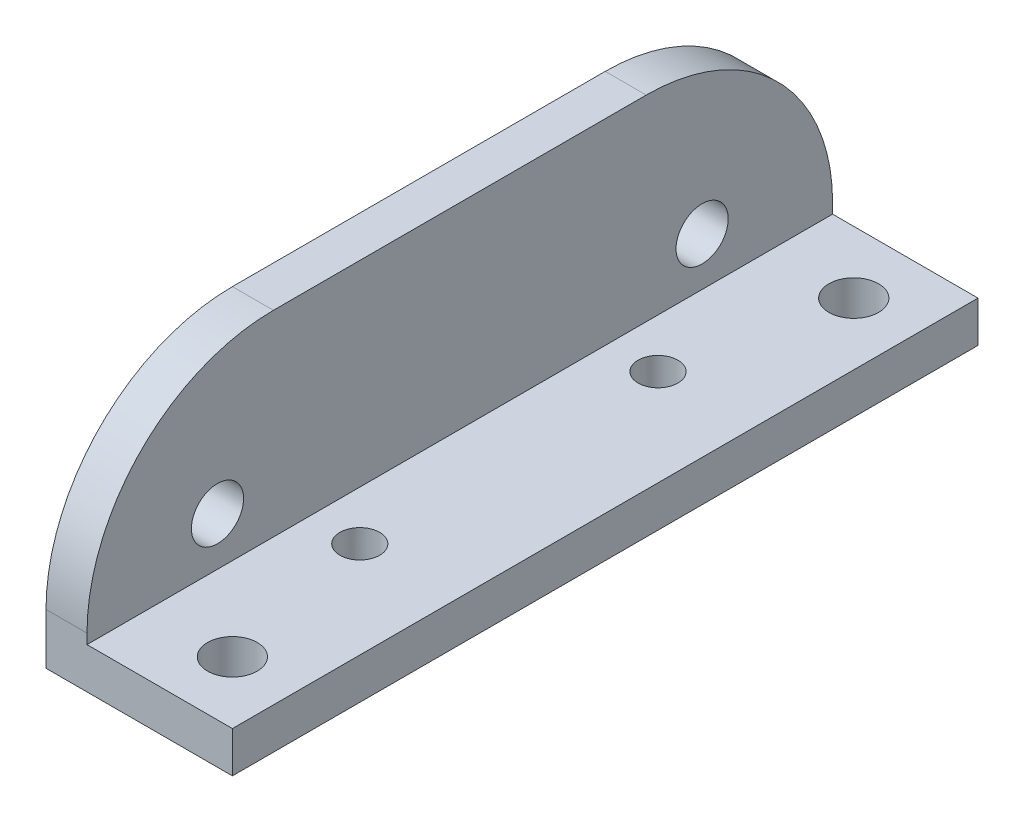
ISO-10303-21;
HEADER;
FILE_DESCRIPTION(('STEP AP214'),'2;1');
FILE_NAME('part.step','',(''),(''),'','','');
FILE_SCHEMA(('AUTOMOTIVE_DESIGN { 1 0 10303 214 1 1 1 1 }'));
ENDSEC;
DATA;
#1=APPLICATION_CONTEXT('core data for automotive mechanical design processes');
#2=APPLICATION_PROTOCOL_DEFINITION('international standard','automotive_design',2000,#1);
#3=PRODUCT_CONTEXT('',#1,'mechanical');
#4=PRODUCT('Part','Part','',(#3));
#5=PRODUCT_RELATED_PRODUCT_CATEGORY('part','',(#4));
#6=PRODUCT_DEFINITION_FORMATION('','',#4);
#7=PRODUCT_DEFINITION_CONTEXT('part definition',#1,'design');
#8=PRODUCT_DEFINITION('design','',#6,#7);
#9=PRODUCT_DEFINITION_SHAPE('','',#8);
#10=(LENGTH_UNIT() NAMED_UNIT(*) SI_UNIT(.MILLI.,.METRE.));
#11=(NAMED_UNIT(*) PLANE_ANGLE_UNIT() SI_UNIT($,.RADIAN.));
#12=(NAMED_UNIT(*) SI_UNIT($,.STERADIAN.) SOLID_ANGLE_UNIT());
#13=UNCERTAINTY_MEASURE_WITH_UNIT(LENGTH_MEASURE(1.E-05),#10,'distance_accuracy_value','');
#14=(GEOMETRIC_REPRESENTATION_CONTEXT(3) GLOBAL_UNCERTAINTY_ASSIGNED_CONTEXT((#13)) GLOBAL_UNIT_ASSIGNED_CONTEXT((#10,
#11,#12)) REPRESENTATION_CONTEXT('',''));
#15=CARTESIAN_POINT('',(0.,0.,0.));
#16=DIRECTION('',(0.,0.,1.));
#17=DIRECTION('',(1.,0.,0.));
#18=AXIS2_PLACEMENT_3D('',#15,#16,#17);
#19=CARTESIAN_POINT('',(3.3,19.1,30.));
#20=DIRECTION('',(-1.,0.,0.));
#21=DIRECTION('',(0.,-1.,0.));
#22=AXIS2_PLACEMENT_3D('',#19,#20,#21);
#23=PLANE('',#22);
#24=CARTESIAN_POINT('',(3.3,7.18,19.5));
#25=DIRECTION('',(-1.,0.,0.));
#26=DIRECTION('',(0.,-1.,0.));
#27=AXIS2_PLACEMENT_3D('',#24,#25,#26);
#28=CIRCLE('',#27,2.09999999999999);
#29=CARTESIAN_POINT('',(3.3,5.08000000000001,19.5));
#30=VERTEX_POINT('',#29);
#31=EDGE_CURVE('E246',#30,#30,#28,.T.);
#32=ORIENTED_EDGE('',*,*,#31,.T.);
#33=EDGE_LOOP('',(#32));
#34=FACE_BOUND('',#33,.T.);
#35=CARTESIAN_POINT('',(3.3,7.18,-19.5));
#36=DIRECTION('',(-1.,0.,0.));
#37=DIRECTION('',(0.,-1.,0.));
#38=AXIS2_PLACEMENT_3D('',#35,#36,#37);
#39=CIRCLE('',#38,2.09999999999999);
#40=CARTESIAN_POINT('',(3.3,5.08000000000001,-19.5));
#41=VERTEX_POINT('',#40);
#42=EDGE_CURVE('E238',#41,#41,#39,.T.);
#43=ORIENTED_EDGE('',*,*,#42,.T.);
#44=EDGE_LOOP('',(#43));
#45=FACE_BOUND('',#44,.T.);
#46=CARTESIAN_POINT('',(3.3,4.1,-15.));
#47=DIRECTION('',(-1.,0.,0.));
#48=DIRECTION('',(0.,-1.,0.));
#49=AXIS2_PLACEMENT_3D('',#46,#47,#48);
#50=CIRCLE('',#49,15.);
#51=CARTESIAN_POINT('',(3.3,19.1,-15.));
#52=VERTEX_POINT('',#51);
#53=CARTESIAN_POINT('',(3.3,4.1,-30.));
#54=VERTEX_POINT('',#53);
#55=EDGE_CURVE('E60',#52,#54,#50,.T.);
#56=ORIENTED_EDGE('',*,*,#55,.F.);
#57=DIRECTION('',(0.,0.,-1.));
#58=VECTOR('',#57,1.);
#59=CARTESIAN_POINT('',(3.3,19.1,30.));
#60=LINE('',#59,#58);
#61=CARTESIAN_POINT('',(3.3,19.1,15.));
#62=VERTEX_POINT('',#61);
#63=EDGE_CURVE('E150',#62,#52,#60,.T.);
#64=ORIENTED_EDGE('',*,*,#63,.F.);
#65=CARTESIAN_POINT('',(3.3,4.1,15.));
#66=DIRECTION('',(-1.,0.,0.));
#67=DIRECTION('',(0.,-1.,0.));
#68=AXIS2_PLACEMENT_3D('',#65,#66,#67);
#69=CIRCLE('',#68,15.);
#70=CARTESIAN_POINT('',(3.3,4.1,30.));
#71=VERTEX_POINT('',#70);
#72=EDGE_CURVE('E174',#62,#71,#69,.F.);
#73=ORIENTED_EDGE('',*,*,#72,.T.);
#74=DIRECTION('',(0.,1.,0.));
#75=VECTOR('',#74,1.);
#76=CARTESIAN_POINT('',(3.3,19.1,30.));
#77=LINE('',#76,#75);
#78=CARTESIAN_POINT('',(3.3,3.3,30.));
#79=VERTEX_POINT('',#78);
#80=EDGE_CURVE('E182',#79,#71,#77,.T.);
#81=ORIENTED_EDGE('',*,*,#80,.F.);
#82=DIRECTION('',(0.,0.,-1.));
#83=VECTOR('',#82,1.);
#84=CARTESIAN_POINT('',(3.3,3.3,30.));
#85=LINE('',#84,#83);
#86=CARTESIAN_POINT('',(3.3,3.3,-30.));
#87=VERTEX_POINT('',#86);
#88=EDGE_CURVE('E154',#79,#87,#85,.T.);
#89=ORIENTED_EDGE('',*,*,#88,.T.);
#90=DIRECTION('',(0.,1.,0.));
#91=VECTOR('',#90,1.);
#92=CARTESIAN_POINT('',(3.3,19.1,-30.));
#93=LINE('',#92,#91);
#94=EDGE_CURVE('E133',#87,#54,#93,.T.);
#95=ORIENTED_EDGE('',*,*,#94,.T.);
#96=EDGE_LOOP('',(#56,#64,#73,#81,#89,#95));
#97=FACE_BOUND('',#96,.T.);
#98=ADVANCED_FACE('F45',(#34,#45,#97),#23,.F.);
#99=CARTESIAN_POINT('',(0.,0.,30.));
#100=DIRECTION('',(1.,0.,0.));
#101=DIRECTION('',(0.,0.,-1.));
#102=AXIS2_PLACEMENT_3D('',#99,#100,#101);
#103=PLANE('',#102);
#104=CARTESIAN_POINT('',(0.,7.18,19.5));
#105=DIRECTION('',(-1.,0.,0.));
#106=DIRECTION('',(0.,0.,1.));
#107=AXIS2_PLACEMENT_3D('',#104,#105,#106);
#108=CIRCLE('',#107,2.09999999999999);
#109=CARTESIAN_POINT('',(0.,7.18,21.6));
#110=VERTEX_POINT('',#109);
#111=EDGE_CURVE('E242',#110,#110,#108,.T.);
#112=ORIENTED_EDGE('',*,*,#111,.F.);
#113=EDGE_LOOP('',(#112));
#114=FACE_BOUND('',#113,.T.);
#115=CARTESIAN_POINT('',(0.,7.18,-19.5));
#116=DIRECTION('',(-1.,0.,0.));
#117=DIRECTION('',(0.,0.,1.));
#118=AXIS2_PLACEMENT_3D('',#115,#116,#117);
#119=CIRCLE('',#118,2.09999999999999);
#120=CARTESIAN_POINT('',(0.,7.18,-17.4));
#121=VERTEX_POINT('',#120);
#122=EDGE_CURVE('E234',#121,#121,#119,.T.);
#123=ORIENTED_EDGE('',*,*,#122,.F.);
#124=EDGE_LOOP('',(#123));
#125=FACE_BOUND('',#124,.T.);
#126=CARTESIAN_POINT('',(0.,4.1,-15.));
#127=DIRECTION('',(-1.,0.,0.));
#128=DIRECTION('',(0.,0.,1.));
#129=AXIS2_PLACEMENT_3D('',#126,#127,#128);
#130=CIRCLE('',#129,15.);
#131=CARTESIAN_POINT('',(0.,19.1,-15.));
#132=VERTEX_POINT('',#131);
#133=CARTESIAN_POINT('',(0.,4.1,-30.));
#134=VERTEX_POINT('',#133);
#135=EDGE_CURVE('E109',#132,#134,#130,.T.);
#136=ORIENTED_EDGE('',*,*,#135,.T.);
#137=DIRECTION('',(0.,-1.,0.));
#138=VECTOR('',#137,1.);
#139=CARTESIAN_POINT('',(0.,0.,-30.));
#140=LINE('',#139,#138);
#141=CARTESIAN_POINT('',(0.,0.,-30.));
#142=VERTEX_POINT('',#141);
#143=EDGE_CURVE('E119',#134,#142,#140,.T.);
#144=ORIENTED_EDGE('',*,*,#143,.T.);
#145=DIRECTION('',(0.,0.,-1.));
#146=VECTOR('',#145,1.);
#147=CARTESIAN_POINT('',(0.,0.,30.));
#148=LINE('',#147,#146);
#149=CARTESIAN_POINT('',(0.,0.,30.));
#150=VERTEX_POINT('',#149);
#151=EDGE_CURVE('E144',#150,#142,#148,.T.);
#152=ORIENTED_EDGE('',*,*,#151,.F.);
#153=DIRECTION('',(0.,-1.,0.));
#154=VECTOR('',#153,1.);
#155=CARTESIAN_POINT('',(0.,0.,30.));
#156=LINE('',#155,#154);
#157=CARTESIAN_POINT('',(0.,4.1,30.));
#158=VERTEX_POINT('',#157);
#159=EDGE_CURVE('E147',#158,#150,#156,.T.);
#160=ORIENTED_EDGE('',*,*,#159,.F.);
#161=CARTESIAN_POINT('',(0.,4.1,15.));
#162=DIRECTION('',(1.,0.,0.));
#163=DIRECTION('',(0.,0.,-1.));
#164=AXIS2_PLACEMENT_3D('',#161,#162,#163);
#165=CIRCLE('',#164,15.);
#166=CARTESIAN_POINT('',(0.,19.1,15.));
#167=VERTEX_POINT('',#166);
#168=EDGE_CURVE('E68',#167,#158,#165,.T.);
#169=ORIENTED_EDGE('',*,*,#168,.F.);
#170=DIRECTION('',(0.,0.,-1.));
#171=VECTOR('',#170,1.);
#172=CARTESIAN_POINT('',(0.,19.1,30.));
#173=LINE('',#172,#171);
#174=EDGE_CURVE('E122',#167,#132,#173,.T.);
#175=ORIENTED_EDGE('',*,*,#174,.T.);
#176=EDGE_LOOP('',(#136,#144,#152,#160,#169,#175));
#177=FACE_BOUND('',#176,.T.);
#178=ADVANCED_FACE('F117',(#114,#125,#177),#103,.F.);
#179=CARTESIAN_POINT('',(0.,0.,30.));
#180=DIRECTION('',(0.,0.,-1.));
#181=DIRECTION('',(-1.,0.,0.));
#182=AXIS2_PLACEMENT_3D('',#179,#180,#181);
#183=PLANE('',#182);
#184=DIRECTION('',(-1.,0.,0.));
#185=VECTOR('',#184,1.);
#186=CARTESIAN_POINT('',(10.,4.1,30.));
#187=LINE('',#186,#185);
#188=EDGE_CURVE('E54',#158,#71,#187,.F.);
#189=ORIENTED_EDGE('',*,*,#188,.F.);
#190=ORIENTED_EDGE('',*,*,#159,.T.);
#191=DIRECTION('',(1.,0.,0.));
#192=VECTOR('',#191,1.);
#193=CARTESIAN_POINT('',(19.1,0.,30.));
#194=LINE('',#193,#192);
#195=CARTESIAN_POINT('',(15.,0.,30.));
#196=VERTEX_POINT('',#195);
#197=EDGE_CURVE('E132',#150,#196,#194,.T.);
#198=ORIENTED_EDGE('',*,*,#197,.T.);
#199=DIRECTION('',(0.,-1.,0.));
#200=VECTOR('',#199,1.);
#201=CARTESIAN_POINT('',(15.,19.1,30.));
#202=LINE('',#201,#200);
#203=CARTESIAN_POINT('',(15.,3.3,30.));
#204=VERTEX_POINT('',#203);
#205=EDGE_CURVE('E253',#204,#196,#202,.T.);
#206=ORIENTED_EDGE('',*,*,#205,.F.);
#207=DIRECTION('',(-1.,0.,0.));
#208=VECTOR('',#207,1.);
#209=CARTESIAN_POINT('',(3.3,3.3,30.));
#210=LINE('',#209,#208);
#211=EDGE_CURVE('E138',#204,#79,#210,.T.);
#212=ORIENTED_EDGE('',*,*,#211,.T.);
#213=ORIENTED_EDGE('',*,*,#80,.T.);
#214=EDGE_LOOP('',(#189,#190,#198,#206,#212,#213));
#215=FACE_BOUND('',#214,.T.);
#216=ADVANCED_FACE('F186',(#215),#183,.F.);
#217=CARTESIAN_POINT('',(19.1,0.,30.));
#218=DIRECTION('',(0.,1.,0.));
#219=DIRECTION('',(-1.,0.,0.));
#220=AXIS2_PLACEMENT_3D('',#217,#218,#219);
#221=PLANE('',#220);
#222=CARTESIAN_POINT('',(7.24999999999996,0.,11.9999999999999));
#223=DIRECTION('',(0.,-1.,0.));
#224=DIRECTION('',(1.,0.,0.));
#225=AXIS2_PLACEMENT_3D('',#222,#223,#224);
#226=CIRCLE('',#225,1.6);
#227=CARTESIAN_POINT('',(8.84999999999997,0.,11.9999999999999));
#228=VERTEX_POINT('',#227);
#229=EDGE_CURVE('E170',#228,#228,#226,.T.);
#230=ORIENTED_EDGE('',*,*,#229,.F.);
#231=EDGE_LOOP('',(#230));
#232=FACE_BOUND('',#231,.T.);
#233=CARTESIAN_POINT('',(7.24999999999992,0.,-12.0000000000001));
#234=DIRECTION('',(0.,-1.,0.));
#235=DIRECTION('',(1.,0.,0.));
#236=AXIS2_PLACEMENT_3D('',#233,#234,#235);
#237=CIRCLE('',#236,1.6);
#238=CARTESIAN_POINT('',(8.84999999999992,0.,-12.0000000000001));
#239=VERTEX_POINT('',#238);
#240=EDGE_CURVE('E166',#239,#239,#237,.T.);
#241=ORIENTED_EDGE('',*,*,#240,.F.);
#242=EDGE_LOOP('',(#241));
#243=FACE_BOUND('',#242,.T.);
#244=CARTESIAN_POINT('',(10.,0.,-25.));
#245=DIRECTION('',(0.,-1.,0.));
#246=DIRECTION('',(0.,0.,-1.));
#247=AXIS2_PLACEMENT_3D('',#244,#245,#246);
#248=CIRCLE('',#247,2.);
#249=CARTESIAN_POINT('',(10.,0.,-27.));
#250=VERTEX_POINT('',#249);
#251=EDGE_CURVE('E226',#250,#250,#248,.T.);
#252=ORIENTED_EDGE('',*,*,#251,.F.);
#253=EDGE_LOOP('',(#252));
#254=FACE_BOUND('',#253,.T.);
#255=DIRECTION('',(1.,0.,0.));
#256=VECTOR('',#255,1.);
#257=CARTESIAN_POINT('',(19.1,0.,-30.));
#258=LINE('',#257,#256);
#259=CARTESIAN_POINT('',(15.,0.,-30.));
#260=VERTEX_POINT('',#259);
#261=EDGE_CURVE('E130',#142,#260,#258,.T.);
#262=ORIENTED_EDGE('',*,*,#261,.T.);
#263=DIRECTION('',(0.,0.,-1.));
#264=VECTOR('',#263,1.);
#265=CARTESIAN_POINT('',(15.,0.,30.));
#266=LINE('',#265,#264);
#267=EDGE_CURVE('E250',#196,#260,#266,.T.);
#268=ORIENTED_EDGE('',*,*,#267,.F.);
#269=ORIENTED_EDGE('',*,*,#197,.F.);
#270=ORIENTED_EDGE('',*,*,#151,.T.);
#271=EDGE_LOOP('',(#262,#268,#269,#270));
#272=FACE_BOUND('',#271,.T.);
#273=CARTESIAN_POINT('',(10.,0.,25.));
#274=DIRECTION('',(0.,-1.,0.));
#275=DIRECTION('',(0.,0.,-1.));
#276=AXIS2_PLACEMENT_3D('',#273,#274,#275);
#277=CIRCLE('',#276,2.);
#278=CARTESIAN_POINT('',(10.,0.,23.));
#279=VERTEX_POINT('',#278);
#280=EDGE_CURVE('E165',#279,#279,#277,.T.);
#281=ORIENTED_EDGE('',*,*,#280,.F.);
#282=EDGE_LOOP('',(#281));
#283=FACE_BOUND('',#282,.T.);
#284=ADVANCED_FACE('F47',(#232,#243,#254,#272,#283),#221,.F.);
#285=CARTESIAN_POINT('',(3.3,3.3,30.));
#286=DIRECTION('',(0.,-1.,0.));
#287=DIRECTION('',(0.,0.,-1.));
#288=AXIS2_PLACEMENT_3D('',#285,#286,#287);
#289=PLANE('',#288);
#290=CARTESIAN_POINT('',(7.24999999999996,3.3,11.9999999999999));
#291=DIRECTION('',(0.,-1.,0.));
#292=DIRECTION('',(0.,0.,-1.));
#293=AXIS2_PLACEMENT_3D('',#290,#291,#292);
#294=CIRCLE('',#293,1.6);
#295=CARTESIAN_POINT('',(7.24999999999996,3.3,10.3999999999999));
#296=VERTEX_POINT('',#295);
#297=EDGE_CURVE('E167',#296,#296,#294,.T.);
#298=ORIENTED_EDGE('',*,*,#297,.T.);
#299=EDGE_LOOP('',(#298));
#300=FACE_BOUND('',#299,.T.);
#301=CARTESIAN_POINT('',(7.24999999999992,3.3,-12.0000000000001));
#302=DIRECTION('',(0.,-1.,0.));
#303=DIRECTION('',(0.,0.,-1.));
#304=AXIS2_PLACEMENT_3D('',#301,#302,#303);
#305=CIRCLE('',#304,1.6);
#306=CARTESIAN_POINT('',(7.24999999999992,3.3,-13.6000000000001));
#307=VERTEX_POINT('',#306);
#308=EDGE_CURVE('E161',#307,#307,#305,.T.);
#309=ORIENTED_EDGE('',*,*,#308,.T.);
#310=EDGE_LOOP('',(#309));
#311=FACE_BOUND('',#310,.T.);
#312=CARTESIAN_POINT('',(10.,3.3,25.));
#313=DIRECTION('',(0.,-1.,0.));
#314=DIRECTION('',(0.,0.,-1.));
#315=AXIS2_PLACEMENT_3D('',#312,#313,#314);
#316=CIRCLE('',#315,2.);
#317=CARTESIAN_POINT('',(10.,3.3,23.));
#318=VERTEX_POINT('',#317);
#319=EDGE_CURVE('E222',#318,#318,#316,.T.);
#320=ORIENTED_EDGE('',*,*,#319,.T.);
#321=EDGE_LOOP('',(#320));
#322=FACE_BOUND('',#321,.T.);
#323=CARTESIAN_POINT('',(10.,3.3,-25.));
#324=DIRECTION('',(0.,-1.,0.));
#325=DIRECTION('',(0.,0.,-1.));
#326=AXIS2_PLACEMENT_3D('',#323,#324,#325);
#327=CIRCLE('',#326,2.);
#328=CARTESIAN_POINT('',(10.,3.3,-27.));
#329=VERTEX_POINT('',#328);
#330=EDGE_CURVE('E230',#329,#329,#327,.T.);
#331=ORIENTED_EDGE('',*,*,#330,.T.);
#332=EDGE_LOOP('',(#331));
#333=FACE_BOUND('',#332,.T.);
#334=ORIENTED_EDGE('',*,*,#211,.F.);
#335=DIRECTION('',(0.,0.,-1.));
#336=VECTOR('',#335,1.);
#337=CARTESIAN_POINT('',(15.,3.3,30.));
#338=LINE('',#337,#336);
#339=CARTESIAN_POINT('',(15.,3.3,-30.));
#340=VERTEX_POINT('',#339);
#341=EDGE_CURVE('E198',#204,#340,#338,.T.);
#342=ORIENTED_EDGE('',*,*,#341,.T.);
#343=DIRECTION('',(-1.,0.,0.));
#344=VECTOR('',#343,1.);
#345=CARTESIAN_POINT('',(3.3,3.3,-30.));
#346=LINE('',#345,#344);
#347=EDGE_CURVE('E140',#340,#87,#346,.T.);
#348=ORIENTED_EDGE('',*,*,#347,.T.);
#349=ORIENTED_EDGE('',*,*,#88,.F.);
#350=EDGE_LOOP('',(#334,#342,#348,#349));
#351=FACE_BOUND('',#350,.T.);
#352=ADVANCED_FACE('F203',(#300,#311,#322,#333,#351),#289,.F.);
#353=CARTESIAN_POINT('',(0.,19.1,30.));
#354=DIRECTION('',(0.,-1.,0.));
#355=DIRECTION('',(0.,0.,-1.));
#356=AXIS2_PLACEMENT_3D('',#353,#354,#355);
#357=PLANE('',#356);
#358=ORIENTED_EDGE('',*,*,#63,.T.);
#359=DIRECTION('',(-1.,0.,0.));
#360=VECTOR('',#359,1.);
#361=CARTESIAN_POINT('',(10.,19.1,-15.));
#362=LINE('',#361,#360);
#363=EDGE_CURVE('E124',#52,#132,#362,.T.);
#364=ORIENTED_EDGE('',*,*,#363,.T.);
#365=ORIENTED_EDGE('',*,*,#174,.F.);
#366=DIRECTION('',(-1.,0.,0.));
#367=VECTOR('',#366,1.);
#368=CARTESIAN_POINT('',(10.,19.1,15.));
#369=LINE('',#368,#367);
#370=EDGE_CURVE('E184',#62,#167,#369,.T.);
#371=ORIENTED_EDGE('',*,*,#370,.F.);
#372=EDGE_LOOP('',(#358,#364,#365,#371));
#373=FACE_BOUND('',#372,.T.);
#374=ADVANCED_FACE('F207',(#373),#357,.F.);
#375=CARTESIAN_POINT('',(0.,0.,-30.));
#376=DIRECTION('',(0.,0.,-1.));
#377=DIRECTION('',(-1.,0.,0.));
#378=AXIS2_PLACEMENT_3D('',#375,#376,#377);
#379=PLANE('',#378);
#380=DIRECTION('',(-1.,0.,0.));
#381=VECTOR('',#380,1.);
#382=CARTESIAN_POINT('',(10.,4.1,-30.));
#383=LINE('',#382,#381);
#384=EDGE_CURVE('E11',#54,#134,#383,.T.);
#385=ORIENTED_EDGE('',*,*,#384,.F.);
#386=ORIENTED_EDGE('',*,*,#94,.F.);
#387=ORIENTED_EDGE('',*,*,#347,.F.);
#388=DIRECTION('',(0.,1.,0.));
#389=VECTOR('',#388,1.);
#390=CARTESIAN_POINT('',(15.,0.,-30.));
#391=LINE('',#390,#389);
#392=EDGE_CURVE('E158',#260,#340,#391,.T.);
#393=ORIENTED_EDGE('',*,*,#392,.F.);
#394=ORIENTED_EDGE('',*,*,#261,.F.);
#395=ORIENTED_EDGE('',*,*,#143,.F.);
#396=EDGE_LOOP('',(#385,#386,#387,#393,#394,#395));
#397=FACE_BOUND('',#396,.T.);
#398=ADVANCED_FACE('F127',(#397),#379,.T.);
#399=CARTESIAN_POINT('',(15.,19.1,30.));
#400=DIRECTION('',(-1.,0.,0.));
#401=DIRECTION('',(0.,0.,1.));
#402=AXIS2_PLACEMENT_3D('',#399,#400,#401);
#403=PLANE('',#402);
#404=ORIENTED_EDGE('',*,*,#205,.T.);
#405=ORIENTED_EDGE('',*,*,#267,.T.);
#406=ORIENTED_EDGE('',*,*,#392,.T.);
#407=ORIENTED_EDGE('',*,*,#341,.F.);
#408=EDGE_LOOP('',(#404,#405,#406,#407));
#409=FACE_BOUND('',#408,.T.);
#410=ADVANCED_FACE('F259',(#409),#403,.F.);
#411=CARTESIAN_POINT('',(0.,7.18,19.5));
#412=DIRECTION('',(-1.,0.,0.));
#413=DIRECTION('',(0.,0.,1.));
#414=AXIS2_PLACEMENT_3D('',#411,#412,#413);
#415=CYLINDRICAL_SURFACE('',#414,2.09999999999999);
#416=ORIENTED_EDGE('',*,*,#111,.T.);
#417=EDGE_LOOP('',(#416));
#418=FACE_BOUND('',#417,.T.);
#419=ORIENTED_EDGE('',*,*,#31,.F.);
#420=EDGE_LOOP('',(#419));
#421=FACE_BOUND('',#420,.T.);
#422=ADVANCED_FACE('F378',(#418,#421),#415,.F.);
#423=CARTESIAN_POINT('',(0.,7.18,-19.5));
#424=DIRECTION('',(-1.,0.,0.));
#425=DIRECTION('',(0.,0.,1.));
#426=AXIS2_PLACEMENT_3D('',#423,#424,#425);
#427=CYLINDRICAL_SURFACE('',#426,2.09999999999999);
#428=ORIENTED_EDGE('',*,*,#122,.T.);
#429=EDGE_LOOP('',(#428));
#430=FACE_BOUND('',#429,.T.);
#431=ORIENTED_EDGE('',*,*,#42,.F.);
#432=EDGE_LOOP('',(#431));
#433=FACE_BOUND('',#432,.T.);
#434=ADVANCED_FACE('F280',(#430,#433),#427,.F.);
#435=CARTESIAN_POINT('',(10.,0.,-25.));
#436=DIRECTION('',(0.,-1.,0.));
#437=DIRECTION('',(0.,0.,-1.));
#438=AXIS2_PLACEMENT_3D('',#435,#436,#437);
#439=CYLINDRICAL_SURFACE('',#438,2.);
#440=ORIENTED_EDGE('',*,*,#330,.F.);
#441=EDGE_LOOP('',(#440));
#442=FACE_BOUND('',#441,.T.);
#443=ORIENTED_EDGE('',*,*,#251,.T.);
#444=EDGE_LOOP('',(#443));
#445=FACE_BOUND('',#444,.T.);
#446=ADVANCED_FACE('F270',(#442,#445),#439,.F.);
#447=CARTESIAN_POINT('',(10.,0.,25.));
#448=DIRECTION('',(0.,-1.,0.));
#449=DIRECTION('',(0.,0.,-1.));
#450=AXIS2_PLACEMENT_3D('',#447,#448,#449);
#451=CYLINDRICAL_SURFACE('',#450,2.);
#452=ORIENTED_EDGE('',*,*,#319,.F.);
#453=EDGE_LOOP('',(#452));
#454=FACE_BOUND('',#453,.T.);
#455=ORIENTED_EDGE('',*,*,#280,.T.);
#456=EDGE_LOOP('',(#455));
#457=FACE_BOUND('',#456,.T.);
#458=ADVANCED_FACE('F267',(#454,#457),#451,.F.);
#459=CARTESIAN_POINT('',(7.24999999999992,19.1,-12.0000000000001));
#460=DIRECTION('',(0.,-1.,0.));
#461=DIRECTION('',(1.,0.,0.));
#462=AXIS2_PLACEMENT_3D('',#459,#460,#461);
#463=CYLINDRICAL_SURFACE('',#462,1.6);
#464=ORIENTED_EDGE('',*,*,#240,.T.);
#465=EDGE_LOOP('',(#464));
#466=FACE_BOUND('',#465,.T.);
#467=ORIENTED_EDGE('',*,*,#308,.F.);
#468=EDGE_LOOP('',(#467));
#469=FACE_BOUND('',#468,.T.);
#470=ADVANCED_FACE('F269',(#466,#469),#463,.F.);
#471=CARTESIAN_POINT('',(7.24999999999997,19.1,11.9999999999999));
#472=DIRECTION('',(0.,-1.,0.));
#473=DIRECTION('',(1.,0.,0.));
#474=AXIS2_PLACEMENT_3D('',#471,#472,#473);
#475=CYLINDRICAL_SURFACE('',#474,1.6);
#476=ORIENTED_EDGE('',*,*,#229,.T.);
#477=EDGE_LOOP('',(#476));
#478=FACE_BOUND('',#477,.T.);
#479=ORIENTED_EDGE('',*,*,#297,.F.);
#480=EDGE_LOOP('',(#479));
#481=FACE_BOUND('',#480,.T.);
#482=ADVANCED_FACE('F277',(#478,#481),#475,.F.);
#483=CARTESIAN_POINT('',(10.,4.1,15.));
#484=DIRECTION('',(-1.,0.,0.));
#485=DIRECTION('',(0.,0.,1.));
#486=AXIS2_PLACEMENT_3D('',#483,#484,#485);
#487=CYLINDRICAL_SURFACE('',#486,15.);
#488=ORIENTED_EDGE('',*,*,#370,.T.);
#489=ORIENTED_EDGE('',*,*,#168,.T.);
#490=ORIENTED_EDGE('',*,*,#188,.T.);
#491=ORIENTED_EDGE('',*,*,#72,.F.);
#492=EDGE_LOOP('',(#488,#489,#490,#491));
#493=FACE_BOUND('',#492,.T.);
#494=ADVANCED_FACE('F173',(#493),#487,.T.);
#495=CARTESIAN_POINT('',(10.,4.1,-15.));
#496=DIRECTION('',(-1.,0.,0.));
#497=DIRECTION('',(0.,0.,1.));
#498=AXIS2_PLACEMENT_3D('',#495,#496,#497);
#499=CYLINDRICAL_SURFACE('',#498,15.);
#500=ORIENTED_EDGE('',*,*,#55,.T.);
#501=ORIENTED_EDGE('',*,*,#384,.T.);
#502=ORIENTED_EDGE('',*,*,#135,.F.);
#503=ORIENTED_EDGE('',*,*,#363,.F.);
#504=EDGE_LOOP('',(#500,#501,#502,#503));
#505=FACE_BOUND('',#504,.T.);
#506=ADVANCED_FACE('F108',(#505),#499,.T.);
#507=CLOSED_SHELL('',(#98,#178,#216,#284,#352,#374,#398,#410,#422,#434,#446,#458,#470,#482,#494,#506));
#508=MANIFOLD_SOLID_BREP('B2',#507);
#509=ADVANCED_BREP_SHAPE_REPRESENTATION('',(#18,#508),#14);
#510=SHAPE_DEFINITION_REPRESENTATION(#9,#509);
ENDSEC;
END-ISO-10303-21;
